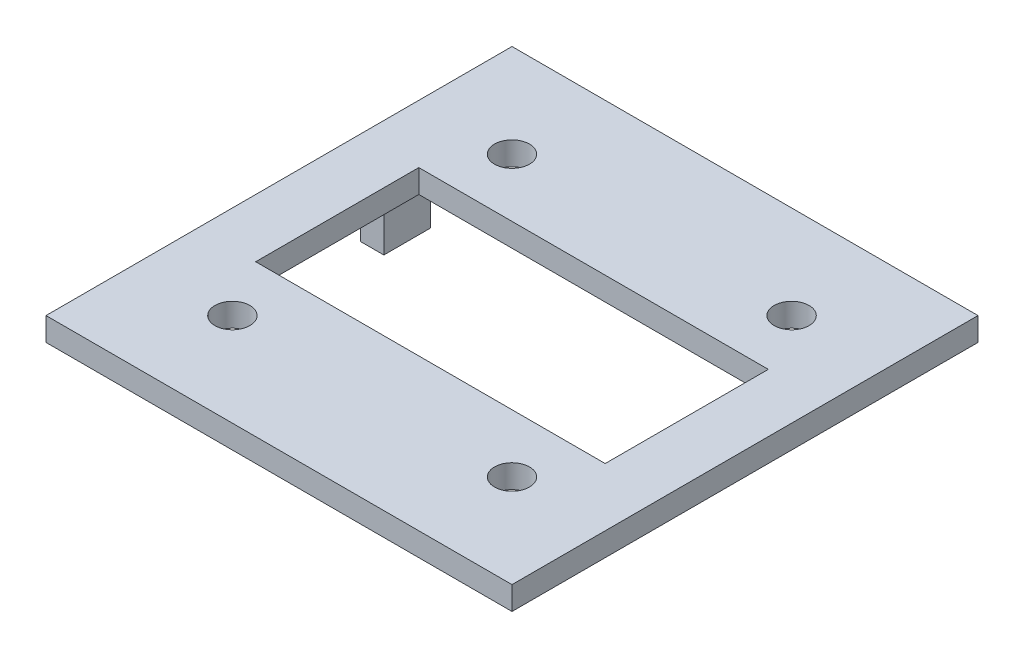
ISO-10303-21;
HEADER;
FILE_DESCRIPTION(('STEP AP214'),'2;1');
FILE_NAME('part.step','',(''),(''),'','','');
FILE_SCHEMA(('AUTOMOTIVE_DESIGN { 1 0 10303 214 1 1 1 1 }'));
ENDSEC;
DATA;
#1=APPLICATION_CONTEXT('core data for automotive mechanical design processes');
#2=APPLICATION_PROTOCOL_DEFINITION('international standard','automotive_design',2000,#1);
#3=PRODUCT_CONTEXT('',#1,'mechanical');
#4=PRODUCT('Part','Part','',(#3));
#5=PRODUCT_RELATED_PRODUCT_CATEGORY('part','',(#4));
#6=PRODUCT_DEFINITION_FORMATION('','',#4);
#7=PRODUCT_DEFINITION_CONTEXT('part definition',#1,'design');
#8=PRODUCT_DEFINITION('design','',#6,#7);
#9=PRODUCT_DEFINITION_SHAPE('','',#8);
#10=(LENGTH_UNIT() NAMED_UNIT(*) SI_UNIT(.MILLI.,.METRE.));
#11=(NAMED_UNIT(*) PLANE_ANGLE_UNIT() SI_UNIT($,.RADIAN.));
#12=(NAMED_UNIT(*) SI_UNIT($,.STERADIAN.) SOLID_ANGLE_UNIT());
#13=UNCERTAINTY_MEASURE_WITH_UNIT(LENGTH_MEASURE(1.E-05),#10,'distance_accuracy_value','');
#14=(GEOMETRIC_REPRESENTATION_CONTEXT(3) GLOBAL_UNCERTAINTY_ASSIGNED_CONTEXT((#13)) GLOBAL_UNIT_ASSIGNED_CONTEXT((#10,
#11,#12)) REPRESENTATION_CONTEXT('',''));
#15=CARTESIAN_POINT('',(0.,0.,0.));
#16=DIRECTION('',(0.,0.,1.));
#17=DIRECTION('',(1.,0.,0.));
#18=AXIS2_PLACEMENT_3D('',#15,#16,#17);
#19=CARTESIAN_POINT('',(0.,0.,0.));
#20=DIRECTION('',(0.,-1.,0.));
#21=DIRECTION('',(0.,0.,-1.));
#22=AXIS2_PLACEMENT_3D('',#19,#20,#21);
#23=PLANE('',#22);
#24=CARTESIAN_POINT('',(-12.,0.,12.));
#25=DIRECTION('',(0.,1.,0.));
#26=DIRECTION('',(0.,0.,1.));
#27=AXIS2_PLACEMENT_3D('',#24,#25,#26);
#28=CIRCLE('',#27,1.5);
#29=CARTESIAN_POINT('',(-12.,0.,13.5));
#30=VERTEX_POINT('',#29);
#31=EDGE_CURVE('E249',#30,#30,#28,.T.);
#32=ORIENTED_EDGE('',*,*,#31,.T.);
#33=EDGE_LOOP('',(#32));
#34=FACE_BOUND('',#33,.T.);
#35=CARTESIAN_POINT('',(-12.,0.,-12.));
#36=DIRECTION('',(0.,1.,0.));
#37=DIRECTION('',(0.,0.,1.));
#38=AXIS2_PLACEMENT_3D('',#35,#36,#37);
#39=CIRCLE('',#38,1.5);
#40=CARTESIAN_POINT('',(-12.,0.,-10.5));
#41=VERTEX_POINT('',#40);
#42=EDGE_CURVE('E265',#41,#41,#39,.T.);
#43=ORIENTED_EDGE('',*,*,#42,.T.);
#44=EDGE_LOOP('',(#43));
#45=FACE_BOUND('',#44,.T.);
#46=DIRECTION('',(1.,0.,0.));
#47=VECTOR('',#46,1.);
#48=CARTESIAN_POINT('',(-15.,0.,7.00059966246));
#49=LINE('',#48,#47);
#50=CARTESIAN_POINT('',(-15.,0.,7.00059966246));
#51=VERTEX_POINT('',#50);
#52=CARTESIAN_POINT('',(15.,0.,7.00059966246));
#53=VERTEX_POINT('',#52);
#54=EDGE_CURVE('E281',#51,#53,#49,.T.);
#55=ORIENTED_EDGE('',*,*,#54,.T.);
#56=DIRECTION('',(0.,0.,-1.));
#57=VECTOR('',#56,1.);
#58=CARTESIAN_POINT('',(15.,0.,7.00059966246));
#59=LINE('',#58,#57);
#60=CARTESIAN_POINT('',(15.,0.,-7.00059966246));
#61=VERTEX_POINT('',#60);
#62=EDGE_CURVE('E273',#53,#61,#59,.T.);
#63=ORIENTED_EDGE('',*,*,#62,.T.);
#64=DIRECTION('',(-1.,0.,0.));
#65=VECTOR('',#64,1.);
#66=CARTESIAN_POINT('',(-15.,0.,-7.00059966246));
#67=LINE('',#66,#65);
#68=CARTESIAN_POINT('',(-15.,0.,-7.00059966246));
#69=VERTEX_POINT('',#68);
#70=EDGE_CURVE('E295',#61,#69,#67,.T.);
#71=ORIENTED_EDGE('',*,*,#70,.T.);
#72=DIRECTION('',(0.,0.,1.));
#73=VECTOR('',#72,1.);
#74=CARTESIAN_POINT('',(-15.,0.,7.00059966246));
#75=LINE('',#74,#73);
#76=EDGE_CURVE('E299',#69,#51,#75,.T.);
#77=ORIENTED_EDGE('',*,*,#76,.T.);
#78=EDGE_LOOP('',(#55,#63,#71,#77));
#79=FACE_BOUND('',#78,.T.);
#80=CARTESIAN_POINT('',(12.,0.,-12.));
#81=DIRECTION('',(0.,1.,0.));
#82=DIRECTION('',(0.,0.,1.));
#83=AXIS2_PLACEMENT_3D('',#80,#81,#82);
#84=CIRCLE('',#83,1.5);
#85=CARTESIAN_POINT('',(12.,0.,-10.5));
#86=VERTEX_POINT('',#85);
#87=EDGE_CURVE('E257',#86,#86,#84,.T.);
#88=ORIENTED_EDGE('',*,*,#87,.T.);
#89=EDGE_LOOP('',(#88));
#90=FACE_BOUND('',#89,.T.);
#91=CARTESIAN_POINT('',(12.,0.,12.));
#92=DIRECTION('',(0.,1.,0.));
#93=DIRECTION('',(0.,0.,1.));
#94=AXIS2_PLACEMENT_3D('',#91,#92,#93);
#95=CIRCLE('',#94,1.5);
#96=CARTESIAN_POINT('',(12.,0.,13.5));
#97=VERTEX_POINT('',#96);
#98=EDGE_CURVE('E167',#97,#97,#95,.T.);
#99=ORIENTED_EDGE('',*,*,#98,.T.);
#100=EDGE_LOOP('',(#99));
#101=FACE_BOUND('',#100,.T.);
#102=DIRECTION('',(0.,0.,1.));
#103=VECTOR('',#102,1.);
#104=CARTESIAN_POINT('',(-18.,0.,0.));
#105=LINE('',#104,#103);
#106=CARTESIAN_POINT('',(-18.,0.,7.));
#107=VERTEX_POINT('',#106);
#108=CARTESIAN_POINT('',(-18.,0.,11.));
#109=VERTEX_POINT('',#108);
#110=EDGE_CURVE('E61',#107,#109,#105,.T.);
#111=ORIENTED_EDGE('',*,*,#110,.F.);
#112=DIRECTION('',(-1.,0.,0.));
#113=VECTOR('',#112,1.);
#114=CARTESIAN_POINT('',(0.,0.,7.));
#115=LINE('',#114,#113);
#116=CARTESIAN_POINT('',(-20.,0.,7.));
#117=VERTEX_POINT('',#116);
#118=EDGE_CURVE('E164',#107,#117,#115,.T.);
#119=ORIENTED_EDGE('',*,*,#118,.T.);
#120=DIRECTION('',(0.,0.,1.));
#121=VECTOR('',#120,1.);
#122=CARTESIAN_POINT('',(-20.,0.,20.));
#123=LINE('',#122,#121);
#124=CARTESIAN_POINT('',(-20.,0.,-7.));
#125=VERTEX_POINT('',#124);
#126=EDGE_CURVE('E346',#125,#117,#123,.T.);
#127=ORIENTED_EDGE('',*,*,#126,.F.);
#128=DIRECTION('',(-1.,0.,0.));
#129=VECTOR('',#128,1.);
#130=CARTESIAN_POINT('',(0.,0.,-7.));
#131=LINE('',#130,#129);
#132=CARTESIAN_POINT('',(-18.,0.,-7.));
#133=VERTEX_POINT('',#132);
#134=EDGE_CURVE('E226',#133,#125,#131,.T.);
#135=ORIENTED_EDGE('',*,*,#134,.F.);
#136=DIRECTION('',(0.,0.,1.));
#137=VECTOR('',#136,1.);
#138=CARTESIAN_POINT('',(-18.,0.,0.));
#139=LINE('',#138,#137);
#140=CARTESIAN_POINT('',(-18.,0.,-11.));
#141=VERTEX_POINT('',#140);
#142=EDGE_CURVE('E68',#141,#133,#139,.T.);
#143=ORIENTED_EDGE('',*,*,#142,.F.);
#144=DIRECTION('',(-1.,0.,0.));
#145=VECTOR('',#144,1.);
#146=CARTESIAN_POINT('',(0.,0.,-11.));
#147=LINE('',#146,#145);
#148=CARTESIAN_POINT('',(-20.,0.,-11.));
#149=VERTEX_POINT('',#148);
#150=EDGE_CURVE('E213',#141,#149,#147,.T.);
#151=ORIENTED_EDGE('',*,*,#150,.T.);
#152=CARTESIAN_POINT('',(-20.,0.,-20.));
#153=VERTEX_POINT('',#152);
#154=EDGE_CURVE('E342',#153,#149,#123,.T.);
#155=ORIENTED_EDGE('',*,*,#154,.F.);
#156=DIRECTION('',(-1.,0.,0.));
#157=VECTOR('',#156,1.);
#158=CARTESIAN_POINT('',(-20.,0.,-20.));
#159=LINE('',#158,#157);
#160=CARTESIAN_POINT('',(20.,0.,-20.));
#161=VERTEX_POINT('',#160);
#162=EDGE_CURVE('E338',#161,#153,#159,.T.);
#163=ORIENTED_EDGE('',*,*,#162,.F.);
#164=DIRECTION('',(0.,0.,-1.));
#165=VECTOR('',#164,1.);
#166=CARTESIAN_POINT('',(20.,0.,20.));
#167=LINE('',#166,#165);
#168=CARTESIAN_POINT('',(20.,0.,20.));
#169=VERTEX_POINT('',#168);
#170=EDGE_CURVE('E319',#169,#161,#167,.T.);
#171=ORIENTED_EDGE('',*,*,#170,.F.);
#172=DIRECTION('',(1.,0.,0.));
#173=VECTOR('',#172,1.);
#174=CARTESIAN_POINT('',(-20.,0.,20.));
#175=LINE('',#174,#173);
#176=CARTESIAN_POINT('',(-20.,0.,20.));
#177=VERTEX_POINT('',#176);
#178=EDGE_CURVE('E325',#177,#169,#175,.T.);
#179=ORIENTED_EDGE('',*,*,#178,.F.);
#180=CARTESIAN_POINT('',(-20.,0.,11.));
#181=VERTEX_POINT('',#180);
#182=EDGE_CURVE('E341',#181,#177,#123,.T.);
#183=ORIENTED_EDGE('',*,*,#182,.F.);
#184=DIRECTION('',(-1.,0.,0.));
#185=VECTOR('',#184,1.);
#186=CARTESIAN_POINT('',(0.,0.,11.));
#187=LINE('',#186,#185);
#188=EDGE_CURVE('E184',#109,#181,#187,.T.);
#189=ORIENTED_EDGE('',*,*,#188,.F.);
#190=EDGE_LOOP('',(#111,#119,#127,#135,#143,#151,#155,#163,#171,#179,#183,#189));
#191=FACE_BOUND('',#190,.T.);
#192=ADVANCED_FACE('F45',(#34,#45,#79,#90,#101,#191),#23,.T.);
#193=CARTESIAN_POINT('',(0.,2.,0.));
#194=DIRECTION('',(0.,-1.,0.));
#195=DIRECTION('',(0.,0.,-1.));
#196=AXIS2_PLACEMENT_3D('',#193,#194,#195);
#197=PLANE('',#196);
#198=DIRECTION('',(0.,0.,-1.));
#199=VECTOR('',#198,1.);
#200=CARTESIAN_POINT('',(20.,2.,20.));
#201=LINE('',#200,#199);
#202=CARTESIAN_POINT('',(20.,2.,20.));
#203=VERTEX_POINT('',#202);
#204=CARTESIAN_POINT('',(20.,2.,-20.));
#205=VERTEX_POINT('',#204);
#206=EDGE_CURVE('E320',#203,#205,#201,.T.);
#207=ORIENTED_EDGE('',*,*,#206,.T.);
#208=DIRECTION('',(-1.,0.,0.));
#209=VECTOR('',#208,1.);
#210=CARTESIAN_POINT('',(-20.,2.,-20.));
#211=LINE('',#210,#209);
#212=CARTESIAN_POINT('',(-20.,2.,-20.));
#213=VERTEX_POINT('',#212);
#214=EDGE_CURVE('E324',#205,#213,#211,.T.);
#215=ORIENTED_EDGE('',*,*,#214,.T.);
#216=DIRECTION('',(0.,0.,1.));
#217=VECTOR('',#216,1.);
#218=CARTESIAN_POINT('',(-20.,2.,20.));
#219=LINE('',#218,#217);
#220=CARTESIAN_POINT('',(-20.,2.,20.));
#221=VERTEX_POINT('',#220);
#222=EDGE_CURVE('E328',#213,#221,#219,.T.);
#223=ORIENTED_EDGE('',*,*,#222,.T.);
#224=DIRECTION('',(1.,0.,0.));
#225=VECTOR('',#224,1.);
#226=CARTESIAN_POINT('',(-20.,2.,20.));
#227=LINE('',#226,#225);
#228=EDGE_CURVE('E331',#221,#203,#227,.T.);
#229=ORIENTED_EDGE('',*,*,#228,.T.);
#230=EDGE_LOOP('',(#207,#215,#223,#229));
#231=FACE_BOUND('',#230,.T.);
#232=DIRECTION('',(0.,0.,-1.));
#233=VECTOR('',#232,1.);
#234=CARTESIAN_POINT('',(15.,2.,7.00059966246));
#235=LINE('',#234,#233);
#236=CARTESIAN_POINT('',(15.,2.,7.00059966246));
#237=VERTEX_POINT('',#236);
#238=CARTESIAN_POINT('',(15.,2.,-7.00059966246));
#239=VERTEX_POINT('',#238);
#240=EDGE_CURVE('E277',#237,#239,#235,.T.);
#241=ORIENTED_EDGE('',*,*,#240,.F.);
#242=DIRECTION('',(1.,0.,0.));
#243=VECTOR('',#242,1.);
#244=CARTESIAN_POINT('',(-15.,2.,7.00059966246));
#245=LINE('',#244,#243);
#246=CARTESIAN_POINT('',(-15.,2.,7.00059966246));
#247=VERTEX_POINT('',#246);
#248=EDGE_CURVE('E288',#247,#237,#245,.T.);
#249=ORIENTED_EDGE('',*,*,#248,.F.);
#250=DIRECTION('',(0.,0.,1.));
#251=VECTOR('',#250,1.);
#252=CARTESIAN_POINT('',(-15.,2.,7.00059966246));
#253=LINE('',#252,#251);
#254=CARTESIAN_POINT('',(-15.,2.,-7.00059966246));
#255=VERTEX_POINT('',#254);
#256=EDGE_CURVE('E284',#255,#247,#253,.T.);
#257=ORIENTED_EDGE('',*,*,#256,.F.);
#258=DIRECTION('',(-1.,0.,0.));
#259=VECTOR('',#258,1.);
#260=CARTESIAN_POINT('',(-15.,2.,-7.00059966246));
#261=LINE('',#260,#259);
#262=EDGE_CURVE('E280',#239,#255,#261,.T.);
#263=ORIENTED_EDGE('',*,*,#262,.F.);
#264=EDGE_LOOP('',(#241,#249,#257,#263));
#265=FACE_BOUND('',#264,.T.);
#266=CARTESIAN_POINT('',(-12.,2.,-12.));
#267=DIRECTION('',(0.,1.,0.));
#268=DIRECTION('',(0.,0.,1.));
#269=AXIS2_PLACEMENT_3D('',#266,#267,#268);
#270=CIRCLE('',#269,1.5);
#271=CARTESIAN_POINT('',(-12.,2.,-10.5));
#272=VERTEX_POINT('',#271);
#273=EDGE_CURVE('E269',#272,#272,#270,.T.);
#274=ORIENTED_EDGE('',*,*,#273,.F.);
#275=EDGE_LOOP('',(#274));
#276=FACE_BOUND('',#275,.T.);
#277=CARTESIAN_POINT('',(12.,2.,-12.));
#278=DIRECTION('',(0.,1.,0.));
#279=DIRECTION('',(0.,0.,1.));
#280=AXIS2_PLACEMENT_3D('',#277,#278,#279);
#281=CIRCLE('',#280,1.5);
#282=CARTESIAN_POINT('',(12.,2.,-10.5));
#283=VERTEX_POINT('',#282);
#284=EDGE_CURVE('E261',#283,#283,#281,.T.);
#285=ORIENTED_EDGE('',*,*,#284,.F.);
#286=EDGE_LOOP('',(#285));
#287=FACE_BOUND('',#286,.T.);
#288=CARTESIAN_POINT('',(-12.,2.,12.));
#289=DIRECTION('',(0.,1.,0.));
#290=DIRECTION('',(0.,0.,1.));
#291=AXIS2_PLACEMENT_3D('',#288,#289,#290);
#292=CIRCLE('',#291,1.5);
#293=CARTESIAN_POINT('',(-12.,2.,13.5));
#294=VERTEX_POINT('',#293);
#295=EDGE_CURVE('E253',#294,#294,#292,.T.);
#296=ORIENTED_EDGE('',*,*,#295,.F.);
#297=EDGE_LOOP('',(#296));
#298=FACE_BOUND('',#297,.T.);
#299=CARTESIAN_POINT('',(12.,2.,12.));
#300=DIRECTION('',(0.,1.,0.));
#301=DIRECTION('',(0.,0.,1.));
#302=AXIS2_PLACEMENT_3D('',#299,#300,#301);
#303=CIRCLE('',#302,1.5);
#304=CARTESIAN_POINT('',(12.,2.,13.5));
#305=VERTEX_POINT('',#304);
#306=EDGE_CURVE('E245',#305,#305,#303,.T.);
#307=ORIENTED_EDGE('',*,*,#306,.F.);
#308=EDGE_LOOP('',(#307));
#309=FACE_BOUND('',#308,.T.);
#310=ADVANCED_FACE('F391',(#231,#265,#276,#287,#298,#309),#197,.F.);
#311=CARTESIAN_POINT('',(20.,2.,20.));
#312=DIRECTION('',(-1.,0.,0.));
#313=DIRECTION('',(0.,0.,1.));
#314=AXIS2_PLACEMENT_3D('',#311,#312,#313);
#315=PLANE('',#314);
#316=ORIENTED_EDGE('',*,*,#170,.T.);
#317=DIRECTION('',(0.,-1.,0.));
#318=VECTOR('',#317,1.);
#319=CARTESIAN_POINT('',(20.,2.,-20.));
#320=LINE('',#319,#318);
#321=EDGE_CURVE('E11',#205,#161,#320,.T.);
#322=ORIENTED_EDGE('',*,*,#321,.F.);
#323=ORIENTED_EDGE('',*,*,#206,.F.);
#324=DIRECTION('',(0.,-1.,0.));
#325=VECTOR('',#324,1.);
#326=CARTESIAN_POINT('',(20.,2.,20.));
#327=LINE('',#326,#325);
#328=EDGE_CURVE('E334',#203,#169,#327,.T.);
#329=ORIENTED_EDGE('',*,*,#328,.T.);
#330=EDGE_LOOP('',(#316,#322,#323,#329));
#331=FACE_BOUND('',#330,.T.);
#332=ADVANCED_FACE('F47',(#331),#315,.F.);
#333=CARTESIAN_POINT('',(-20.,2.,-20.));
#334=DIRECTION('',(0.,0.,1.));
#335=DIRECTION('',(1.,0.,0.));
#336=AXIS2_PLACEMENT_3D('',#333,#334,#335);
#337=PLANE('',#336);
#338=ORIENTED_EDGE('',*,*,#162,.T.);
#339=DIRECTION('',(0.,-1.,0.));
#340=VECTOR('',#339,1.);
#341=CARTESIAN_POINT('',(-20.,2.,-20.));
#342=LINE('',#341,#340);
#343=EDGE_CURVE('E54',#213,#153,#342,.T.);
#344=ORIENTED_EDGE('',*,*,#343,.F.);
#345=ORIENTED_EDGE('',*,*,#214,.F.);
#346=ORIENTED_EDGE('',*,*,#321,.T.);
#347=EDGE_LOOP('',(#338,#344,#345,#346));
#348=FACE_BOUND('',#347,.T.);
#349=ADVANCED_FACE('F393',(#348),#337,.F.);
#350=CARTESIAN_POINT('',(-20.,2.,20.));
#351=DIRECTION('',(1.,0.,0.));
#352=DIRECTION('',(0.,0.,-1.));
#353=AXIS2_PLACEMENT_3D('',#350,#351,#352);
#354=PLANE('',#353);
#355=ORIENTED_EDGE('',*,*,#154,.T.);
#356=DIRECTION('',(0.,1.,0.));
#357=VECTOR('',#356,1.);
#358=CARTESIAN_POINT('',(-20.,-6.,-11.));
#359=LINE('',#358,#357);
#360=CARTESIAN_POINT('',(-20.,-6.,-11.));
#361=VERTEX_POINT('',#360);
#362=EDGE_CURVE('E234',#361,#149,#359,.T.);
#363=ORIENTED_EDGE('',*,*,#362,.F.);
#364=DIRECTION('',(0.,0.,-1.));
#365=VECTOR('',#364,1.);
#366=CARTESIAN_POINT('',(-20.,-6.,0.));
#367=LINE('',#366,#365);
#368=CARTESIAN_POINT('',(-20.,-6.,-7.));
#369=VERTEX_POINT('',#368);
#370=EDGE_CURVE('E216',#369,#361,#367,.T.);
#371=ORIENTED_EDGE('',*,*,#370,.F.);
#372=DIRECTION('',(0.,1.,0.));
#373=VECTOR('',#372,1.);
#374=CARTESIAN_POINT('',(-20.,-6.,-7.));
#375=LINE('',#374,#373);
#376=EDGE_CURVE('E238',#369,#125,#375,.T.);
#377=ORIENTED_EDGE('',*,*,#376,.T.);
#378=ORIENTED_EDGE('',*,*,#126,.T.);
#379=DIRECTION('',(0.,1.,0.));
#380=VECTOR('',#379,1.);
#381=CARTESIAN_POINT('',(-20.,-6.,7.));
#382=LINE('',#381,#380);
#383=CARTESIAN_POINT('',(-20.,-6.,7.));
#384=VERTEX_POINT('',#383);
#385=EDGE_CURVE('E194',#384,#117,#382,.T.);
#386=ORIENTED_EDGE('',*,*,#385,.F.);
#387=DIRECTION('',(0.,0.,-1.));
#388=VECTOR('',#387,1.);
#389=CARTESIAN_POINT('',(-20.,-6.,0.));
#390=LINE('',#389,#388);
#391=CARTESIAN_POINT('',(-20.,-6.,11.));
#392=VERTEX_POINT('',#391);
#393=EDGE_CURVE('E181',#392,#384,#390,.T.);
#394=ORIENTED_EDGE('',*,*,#393,.F.);
#395=DIRECTION('',(0.,1.,0.));
#396=VECTOR('',#395,1.);
#397=CARTESIAN_POINT('',(-20.,-6.,11.));
#398=LINE('',#397,#396);
#399=EDGE_CURVE('E202',#392,#181,#398,.T.);
#400=ORIENTED_EDGE('',*,*,#399,.T.);
#401=ORIENTED_EDGE('',*,*,#182,.T.);
#402=DIRECTION('',(0.,-1.,0.));
#403=VECTOR('',#402,1.);
#404=CARTESIAN_POINT('',(-20.,2.,20.));
#405=LINE('',#404,#403);
#406=EDGE_CURVE('E352',#221,#177,#405,.T.);
#407=ORIENTED_EDGE('',*,*,#406,.F.);
#408=ORIENTED_EDGE('',*,*,#222,.F.);
#409=ORIENTED_EDGE('',*,*,#343,.T.);
#410=EDGE_LOOP('',(#355,#363,#371,#377,#378,#386,#394,#400,#401,#407,#408,#409));
#411=FACE_BOUND('',#410,.T.);
#412=ADVANCED_FACE('F361',(#411),#354,.F.);
#413=CARTESIAN_POINT('',(-20.,2.,20.));
#414=DIRECTION('',(0.,0.,-1.));
#415=DIRECTION('',(-1.,0.,0.));
#416=AXIS2_PLACEMENT_3D('',#413,#414,#415);
#417=PLANE('',#416);
#418=ORIENTED_EDGE('',*,*,#178,.T.);
#419=ORIENTED_EDGE('',*,*,#328,.F.);
#420=ORIENTED_EDGE('',*,*,#228,.F.);
#421=ORIENTED_EDGE('',*,*,#406,.T.);
#422=EDGE_LOOP('',(#418,#419,#420,#421));
#423=FACE_BOUND('',#422,.T.);
#424=ADVANCED_FACE('F385',(#423),#417,.F.);
#425=CARTESIAN_POINT('',(15.,2.,7.00059966246));
#426=DIRECTION('',(-1.,0.,0.));
#427=DIRECTION('',(0.,0.,1.));
#428=AXIS2_PLACEMENT_3D('',#425,#426,#427);
#429=PLANE('',#428);
#430=ORIENTED_EDGE('',*,*,#62,.F.);
#431=DIRECTION('',(0.,-1.,0.));
#432=VECTOR('',#431,1.);
#433=CARTESIAN_POINT('',(15.,2.,7.00059966246));
#434=LINE('',#433,#432);
#435=EDGE_CURVE('E291',#237,#53,#434,.T.);
#436=ORIENTED_EDGE('',*,*,#435,.F.);
#437=ORIENTED_EDGE('',*,*,#240,.T.);
#438=DIRECTION('',(0.,-1.,0.));
#439=VECTOR('',#438,1.);
#440=CARTESIAN_POINT('',(15.,2.,-7.00059966246));
#441=LINE('',#440,#439);
#442=EDGE_CURVE('E315',#239,#61,#441,.T.);
#443=ORIENTED_EDGE('',*,*,#442,.T.);
#444=EDGE_LOOP('',(#430,#436,#437,#443));
#445=FACE_BOUND('',#444,.T.);
#446=ADVANCED_FACE('F412',(#445),#429,.T.);
#447=CARTESIAN_POINT('',(-15.,2.,-7.00059966246));
#448=DIRECTION('',(0.,0.,1.));
#449=DIRECTION('',(1.,0.,0.));
#450=AXIS2_PLACEMENT_3D('',#447,#448,#449);
#451=PLANE('',#450);
#452=ORIENTED_EDGE('',*,*,#70,.F.);
#453=ORIENTED_EDGE('',*,*,#442,.F.);
#454=ORIENTED_EDGE('',*,*,#262,.T.);
#455=DIRECTION('',(0.,-1.,0.));
#456=VECTOR('',#455,1.);
#457=CARTESIAN_POINT('',(-15.,2.,-7.00059966246));
#458=LINE('',#457,#456);
#459=EDGE_CURVE('E312',#255,#69,#458,.T.);
#460=ORIENTED_EDGE('',*,*,#459,.T.);
#461=EDGE_LOOP('',(#452,#453,#454,#460));
#462=FACE_BOUND('',#461,.T.);
#463=ADVANCED_FACE('F416',(#462),#451,.T.);
#464=CARTESIAN_POINT('',(-15.,2.,7.00059966246));
#465=DIRECTION('',(1.,0.,0.));
#466=DIRECTION('',(0.,0.,-1.));
#467=AXIS2_PLACEMENT_3D('',#464,#465,#466);
#468=PLANE('',#467);
#469=ORIENTED_EDGE('',*,*,#76,.F.);
#470=ORIENTED_EDGE('',*,*,#459,.F.);
#471=ORIENTED_EDGE('',*,*,#256,.T.);
#472=DIRECTION('',(0.,-1.,0.));
#473=VECTOR('',#472,1.);
#474=CARTESIAN_POINT('',(-15.,2.,7.00059966246));
#475=LINE('',#474,#473);
#476=EDGE_CURVE('E309',#247,#51,#475,.T.);
#477=ORIENTED_EDGE('',*,*,#476,.T.);
#478=EDGE_LOOP('',(#469,#470,#471,#477));
#479=FACE_BOUND('',#478,.T.);
#480=ADVANCED_FACE('F421',(#479),#468,.T.);
#481=CARTESIAN_POINT('',(-15.,2.,7.00059966246));
#482=DIRECTION('',(0.,0.,-1.));
#483=DIRECTION('',(-1.,0.,0.));
#484=AXIS2_PLACEMENT_3D('',#481,#482,#483);
#485=PLANE('',#484);
#486=ORIENTED_EDGE('',*,*,#54,.F.);
#487=ORIENTED_EDGE('',*,*,#476,.F.);
#488=ORIENTED_EDGE('',*,*,#248,.T.);
#489=ORIENTED_EDGE('',*,*,#435,.T.);
#490=EDGE_LOOP('',(#486,#487,#488,#489));
#491=FACE_BOUND('',#490,.T.);
#492=ADVANCED_FACE('F427',(#491),#485,.T.);
#493=CARTESIAN_POINT('',(-12.,2.,-12.));
#494=DIRECTION('',(0.,-1.,0.));
#495=DIRECTION('',(0.,0.,-1.));
#496=AXIS2_PLACEMENT_3D('',#493,#494,#495);
#497=CYLINDRICAL_SURFACE('',#496,1.5);
#498=ORIENTED_EDGE('',*,*,#273,.T.);
#499=EDGE_LOOP('',(#498));
#500=FACE_BOUND('',#499,.T.);
#501=ORIENTED_EDGE('',*,*,#42,.F.);
#502=EDGE_LOOP('',(#501));
#503=FACE_BOUND('',#502,.T.);
#504=ADVANCED_FACE('F431',(#500,#503),#497,.F.);
#505=CARTESIAN_POINT('',(12.,2.,-12.));
#506=DIRECTION('',(0.,-1.,0.));
#507=DIRECTION('',(0.,0.,-1.));
#508=AXIS2_PLACEMENT_3D('',#505,#506,#507);
#509=CYLINDRICAL_SURFACE('',#508,1.5);
#510=ORIENTED_EDGE('',*,*,#284,.T.);
#511=EDGE_LOOP('',(#510));
#512=FACE_BOUND('',#511,.T.);
#513=ORIENTED_EDGE('',*,*,#87,.F.);
#514=EDGE_LOOP('',(#513));
#515=FACE_BOUND('',#514,.T.);
#516=ADVANCED_FACE('F435',(#512,#515),#509,.F.);
#517=CARTESIAN_POINT('',(-12.,2.,12.));
#518=DIRECTION('',(0.,-1.,0.));
#519=DIRECTION('',(0.,0.,-1.));
#520=AXIS2_PLACEMENT_3D('',#517,#518,#519);
#521=CYLINDRICAL_SURFACE('',#520,1.5);
#522=ORIENTED_EDGE('',*,*,#295,.T.);
#523=EDGE_LOOP('',(#522));
#524=FACE_BOUND('',#523,.T.);
#525=ORIENTED_EDGE('',*,*,#31,.F.);
#526=EDGE_LOOP('',(#525));
#527=FACE_BOUND('',#526,.T.);
#528=ADVANCED_FACE('F439',(#524,#527),#521,.F.);
#529=CARTESIAN_POINT('',(12.,2.,12.));
#530=DIRECTION('',(0.,-1.,0.));
#531=DIRECTION('',(0.,0.,-1.));
#532=AXIS2_PLACEMENT_3D('',#529,#530,#531);
#533=CYLINDRICAL_SURFACE('',#532,1.5);
#534=ORIENTED_EDGE('',*,*,#306,.T.);
#535=EDGE_LOOP('',(#534));
#536=FACE_BOUND('',#535,.T.);
#537=ORIENTED_EDGE('',*,*,#98,.F.);
#538=EDGE_LOOP('',(#537));
#539=FACE_BOUND('',#538,.T.);
#540=ADVANCED_FACE('F443',(#536,#539),#533,.F.);
#541=CARTESIAN_POINT('',(-18.,-6.,0.));
#542=DIRECTION('',(-1.,0.,0.));
#543=DIRECTION('',(0.,0.,1.));
#544=AXIS2_PLACEMENT_3D('',#541,#542,#543);
#545=PLANE('',#544);
#546=ORIENTED_EDGE('',*,*,#142,.T.);
#547=DIRECTION('',(0.,1.,0.));
#548=VECTOR('',#547,1.);
#549=CARTESIAN_POINT('',(-18.,-6.,-7.));
#550=LINE('',#549,#548);
#551=CARTESIAN_POINT('',(-18.,-6.,-7.));
#552=VERTEX_POINT('',#551);
#553=EDGE_CURVE('E197',#552,#133,#550,.T.);
#554=ORIENTED_EDGE('',*,*,#553,.F.);
#555=DIRECTION('',(0.,0.,1.));
#556=VECTOR('',#555,1.);
#557=CARTESIAN_POINT('',(-18.,-6.,0.));
#558=LINE('',#557,#556);
#559=CARTESIAN_POINT('',(-18.,-6.,-11.));
#560=VERTEX_POINT('',#559);
#561=EDGE_CURVE('E208',#560,#552,#558,.T.);
#562=ORIENTED_EDGE('',*,*,#561,.F.);
#563=DIRECTION('',(0.,1.,0.));
#564=VECTOR('',#563,1.);
#565=CARTESIAN_POINT('',(-18.,-6.,-11.));
#566=LINE('',#565,#564);
#567=EDGE_CURVE('E223',#560,#141,#566,.T.);
#568=ORIENTED_EDGE('',*,*,#567,.T.);
#569=EDGE_LOOP('',(#546,#554,#562,#568));
#570=FACE_BOUND('',#569,.T.);
#571=ADVANCED_FACE('F446',(#570),#545,.F.);
#572=CARTESIAN_POINT('',(0.,-6.,-7.));
#573=DIRECTION('',(0.,0.,-1.));
#574=DIRECTION('',(-1.,0.,0.));
#575=AXIS2_PLACEMENT_3D('',#572,#573,#574);
#576=PLANE('',#575);
#577=ORIENTED_EDGE('',*,*,#134,.T.);
#578=ORIENTED_EDGE('',*,*,#376,.F.);
#579=DIRECTION('',(-1.,0.,0.));
#580=VECTOR('',#579,1.);
#581=CARTESIAN_POINT('',(0.,-6.,-7.));
#582=LINE('',#581,#580);
#583=EDGE_CURVE('E212',#552,#369,#582,.T.);
#584=ORIENTED_EDGE('',*,*,#583,.F.);
#585=ORIENTED_EDGE('',*,*,#553,.T.);
#586=EDGE_LOOP('',(#577,#578,#584,#585));
#587=FACE_BOUND('',#586,.T.);
#588=ADVANCED_FACE('F378',(#587),#576,.F.);
#589=CARTESIAN_POINT('',(0.,-6.,-11.));
#590=DIRECTION('',(0.,0.,-1.));
#591=DIRECTION('',(-1.,0.,0.));
#592=AXIS2_PLACEMENT_3D('',#589,#590,#591);
#593=PLANE('',#592);
#594=ORIENTED_EDGE('',*,*,#150,.F.);
#595=ORIENTED_EDGE('',*,*,#567,.F.);
#596=DIRECTION('',(-1.,0.,0.));
#597=VECTOR('',#596,1.);
#598=CARTESIAN_POINT('',(0.,-6.,-11.));
#599=LINE('',#598,#597);
#600=EDGE_CURVE('E219',#560,#361,#599,.T.);
#601=ORIENTED_EDGE('',*,*,#600,.T.);
#602=ORIENTED_EDGE('',*,*,#362,.T.);
#603=EDGE_LOOP('',(#594,#595,#601,#602));
#604=FACE_BOUND('',#603,.T.);
#605=ADVANCED_FACE('F368',(#604),#593,.T.);
#606=CARTESIAN_POINT('',(0.,-6.,0.));
#607=DIRECTION('',(0.,-1.,0.));
#608=DIRECTION('',(0.,0.,-1.));
#609=AXIS2_PLACEMENT_3D('',#606,#607,#608);
#610=PLANE('',#609);
#611=ORIENTED_EDGE('',*,*,#561,.T.);
#612=ORIENTED_EDGE('',*,*,#583,.T.);
#613=ORIENTED_EDGE('',*,*,#370,.T.);
#614=ORIENTED_EDGE('',*,*,#600,.F.);
#615=EDGE_LOOP('',(#611,#612,#613,#614));
#616=FACE_BOUND('',#615,.T.);
#617=ADVANCED_FACE('F375',(#616),#610,.T.);
#618=CARTESIAN_POINT('',(0.,-6.,7.));
#619=DIRECTION('',(0.,0.,-1.));
#620=DIRECTION('',(-1.,0.,0.));
#621=AXIS2_PLACEMENT_3D('',#618,#619,#620);
#622=PLANE('',#621);
#623=ORIENTED_EDGE('',*,*,#118,.F.);
#624=DIRECTION('',(0.,1.,0.));
#625=VECTOR('',#624,1.);
#626=CARTESIAN_POINT('',(-18.,-6.,7.));
#627=LINE('',#626,#625);
#628=CARTESIAN_POINT('',(-18.,-6.,7.));
#629=VERTEX_POINT('',#628);
#630=EDGE_CURVE('E158',#629,#107,#627,.T.);
#631=ORIENTED_EDGE('',*,*,#630,.F.);
#632=DIRECTION('',(-1.,0.,0.));
#633=VECTOR('',#632,1.);
#634=CARTESIAN_POINT('',(0.,-6.,7.));
#635=LINE('',#634,#633);
#636=EDGE_CURVE('E163',#629,#384,#635,.T.);
#637=ORIENTED_EDGE('',*,*,#636,.T.);
#638=ORIENTED_EDGE('',*,*,#385,.T.);
#639=EDGE_LOOP('',(#623,#631,#637,#638));
#640=FACE_BOUND('',#639,.T.);
#641=ADVANCED_FACE('F160',(#640),#622,.T.);
#642=CARTESIAN_POINT('',(-18.,-6.,0.));
#643=DIRECTION('',(-1.,0.,0.));
#644=DIRECTION('',(0.,0.,1.));
#645=AXIS2_PLACEMENT_3D('',#642,#643,#644);
#646=PLANE('',#645);
#647=ORIENTED_EDGE('',*,*,#110,.T.);
#648=DIRECTION('',(0.,1.,0.));
#649=VECTOR('',#648,1.);
#650=CARTESIAN_POINT('',(-18.,-6.,11.));
#651=LINE('',#650,#649);
#652=CARTESIAN_POINT('',(-18.,-6.,11.));
#653=VERTEX_POINT('',#652);
#654=EDGE_CURVE('E168',#653,#109,#651,.T.);
#655=ORIENTED_EDGE('',*,*,#654,.F.);
#656=DIRECTION('',(0.,0.,1.));
#657=VECTOR('',#656,1.);
#658=CARTESIAN_POINT('',(-18.,-6.,0.));
#659=LINE('',#658,#657);
#660=EDGE_CURVE('E171',#629,#653,#659,.T.);
#661=ORIENTED_EDGE('',*,*,#660,.F.);
#662=ORIENTED_EDGE('',*,*,#630,.T.);
#663=EDGE_LOOP('',(#647,#655,#661,#662));
#664=FACE_BOUND('',#663,.T.);
#665=ADVANCED_FACE('F172',(#664),#646,.F.);
#666=CARTESIAN_POINT('',(0.,-6.,11.));
#667=DIRECTION('',(0.,0.,-1.));
#668=DIRECTION('',(-1.,0.,0.));
#669=AXIS2_PLACEMENT_3D('',#666,#667,#668);
#670=PLANE('',#669);
#671=ORIENTED_EDGE('',*,*,#188,.T.);
#672=ORIENTED_EDGE('',*,*,#399,.F.);
#673=DIRECTION('',(-1.,0.,0.));
#674=VECTOR('',#673,1.);
#675=CARTESIAN_POINT('',(0.,-6.,11.));
#676=LINE('',#675,#674);
#677=EDGE_CURVE('E177',#653,#392,#676,.T.);
#678=ORIENTED_EDGE('',*,*,#677,.F.);
#679=ORIENTED_EDGE('',*,*,#654,.T.);
#680=EDGE_LOOP('',(#671,#672,#678,#679));
#681=FACE_BOUND('',#680,.T.);
#682=ADVANCED_FACE('F461',(#681),#670,.F.);
#683=CARTESIAN_POINT('',(0.,-6.,0.));
#684=DIRECTION('',(0.,-1.,0.));
#685=DIRECTION('',(0.,0.,-1.));
#686=AXIS2_PLACEMENT_3D('',#683,#684,#685);
#687=PLANE('',#686);
#688=ORIENTED_EDGE('',*,*,#636,.F.);
#689=ORIENTED_EDGE('',*,*,#660,.T.);
#690=ORIENTED_EDGE('',*,*,#677,.T.);
#691=ORIENTED_EDGE('',*,*,#393,.T.);
#692=EDGE_LOOP('',(#688,#689,#690,#691));
#693=FACE_BOUND('',#692,.T.);
#694=ADVANCED_FACE('F179',(#693),#687,.T.);
#695=CLOSED_SHELL('',(#192,#310,#332,#349,#412,#424,#446,#463,#480,#492,#504,#516,#528,#540,
#571,#588,#605,#617,#641,#665,#682,#694));
#696=MANIFOLD_SOLID_BREP('B2',#695);
#697=ADVANCED_BREP_SHAPE_REPRESENTATION('',(#18,#696),#14);
#698=SHAPE_DEFINITION_REPRESENTATION(#9,#697);
ENDSEC;
END-ISO-10303-21;
